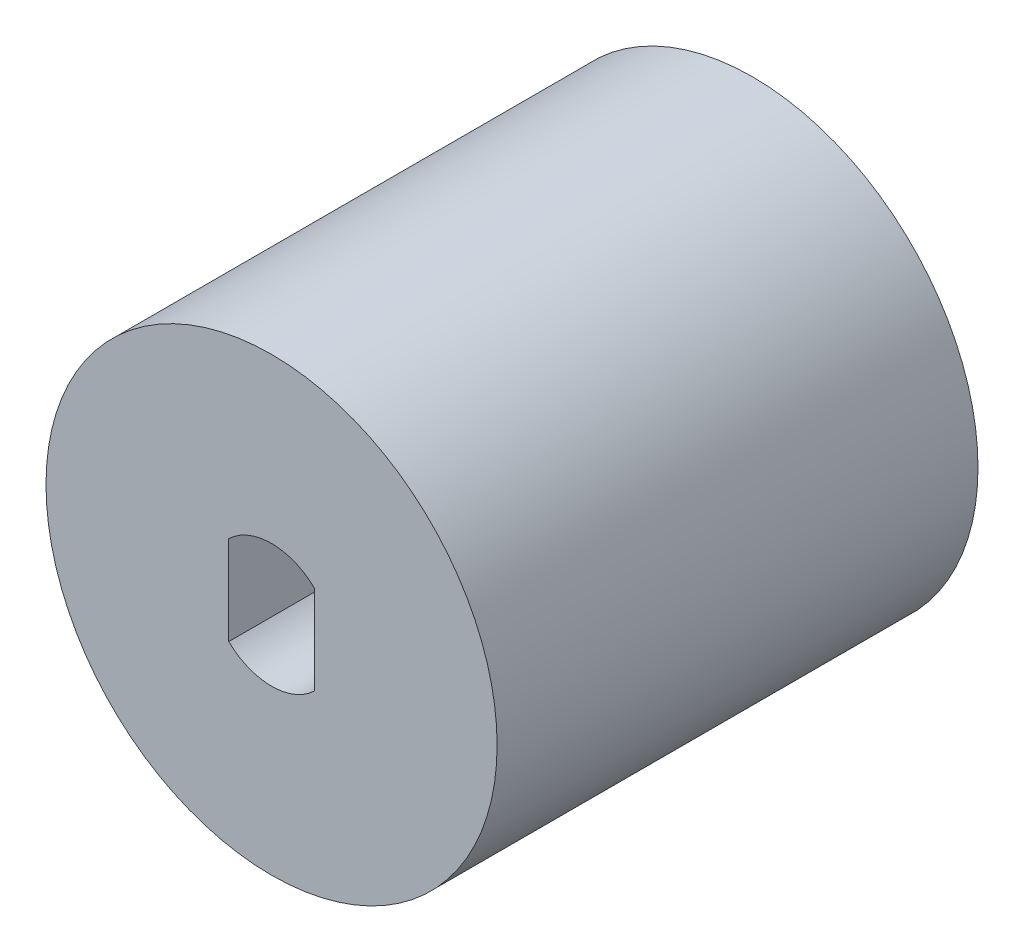
ISO-10303-21;
HEADER;
FILE_DESCRIPTION(('STEP AP214'),'2;1');
FILE_NAME('part.step','',(''),(''),'','','');
FILE_SCHEMA(('AUTOMOTIVE_DESIGN { 1 0 10303 214 1 1 1 1 }'));
ENDSEC;
DATA;
#1=APPLICATION_CONTEXT('core data for automotive mechanical design processes');
#2=APPLICATION_PROTOCOL_DEFINITION('international standard','automotive_design',2000,#1);
#3=PRODUCT_CONTEXT('',#1,'mechanical');
#4=PRODUCT('Part','Part','',(#3));
#5=PRODUCT_RELATED_PRODUCT_CATEGORY('part','',(#4));
#6=PRODUCT_DEFINITION_FORMATION('','',#4);
#7=PRODUCT_DEFINITION_CONTEXT('part definition',#1,'design');
#8=PRODUCT_DEFINITION('design','',#6,#7);
#9=PRODUCT_DEFINITION_SHAPE('','',#8);
#10=(LENGTH_UNIT() NAMED_UNIT(*) SI_UNIT(.MILLI.,.METRE.));
#11=(NAMED_UNIT(*) PLANE_ANGLE_UNIT() SI_UNIT($,.RADIAN.));
#12=(NAMED_UNIT(*) SI_UNIT($,.STERADIAN.) SOLID_ANGLE_UNIT());
#13=UNCERTAINTY_MEASURE_WITH_UNIT(LENGTH_MEASURE(1.E-05),#10,'distance_accuracy_value','');
#14=(GEOMETRIC_REPRESENTATION_CONTEXT(3) GLOBAL_UNCERTAINTY_ASSIGNED_CONTEXT((#13)) GLOBAL_UNIT_ASSIGNED_CONTEXT((#10,
#11,#12)) REPRESENTATION_CONTEXT('',''));
#15=CARTESIAN_POINT('',(0.,0.,0.));
#16=DIRECTION('',(0.,0.,1.));
#17=DIRECTION('',(1.,0.,0.));
#18=AXIS2_PLACEMENT_3D('',#15,#16,#17);
#19=CARTESIAN_POINT('',(0.,0.,21.));
#20=DIRECTION('',(0.,0.,1.));
#21=DIRECTION('',(1.,0.,0.));
#22=AXIS2_PLACEMENT_3D('',#19,#20,#21);
#23=PLANE('',#22);
#24=CARTESIAN_POINT('',(0.,0.,21.));
#25=DIRECTION('',(0.,0.,1.));
#26=DIRECTION('',(1.,0.,0.));
#27=AXIS2_PLACEMENT_3D('',#24,#25,#26);
#28=CIRCLE('',#27,9.85);
#29=CARTESIAN_POINT('',(-9.85,0.,21.));
#30=VERTEX_POINT('',#29);
#31=EDGE_CURVE('E11',#30,#30,#28,.T.);
#32=ORIENTED_EDGE('',*,*,#31,.T.);
#33=EDGE_LOOP('',(#32));
#34=FACE_BOUND('',#33,.T.);
#35=DIRECTION('',(0.,-1.,0.));
#36=VECTOR('',#35,1.);
#37=CARTESIAN_POINT('',(-1.87,1.94758825217241,21.));
#38=LINE('',#37,#36);
#39=CARTESIAN_POINT('',(-1.87,1.94758825217241,21.));
#40=VERTEX_POINT('',#39);
#41=CARTESIAN_POINT('',(-1.87,-1.94758825217241,21.));
#42=VERTEX_POINT('',#41);
#43=EDGE_CURVE('E84',#40,#42,#38,.T.);
#44=ORIENTED_EDGE('',*,*,#43,.F.);
#45=CARTESIAN_POINT('',(0.,0.,21.));
#46=DIRECTION('',(0.,0.,1.));
#47=DIRECTION('',(1.,0.,0.));
#48=AXIS2_PLACEMENT_3D('',#45,#46,#47);
#49=CIRCLE('',#48,2.7);
#50=CARTESIAN_POINT('',(1.87,1.94758825217241,21.));
#51=VERTEX_POINT('',#50);
#52=EDGE_CURVE('E89',#51,#40,#49,.T.);
#53=ORIENTED_EDGE('',*,*,#52,.F.);
#54=DIRECTION('',(0.,1.,0.));
#55=VECTOR('',#54,1.);
#56=CARTESIAN_POINT('',(1.87,1.94758825217241,21.));
#57=LINE('',#56,#55);
#58=CARTESIAN_POINT('',(1.87,-1.94758825217242,21.));
#59=VERTEX_POINT('',#58);
#60=EDGE_CURVE('E95',#59,#51,#57,.T.);
#61=ORIENTED_EDGE('',*,*,#60,.F.);
#62=CARTESIAN_POINT('',(0.,0.,21.));
#63=DIRECTION('',(0.,0.,1.));
#64=DIRECTION('',(1.,0.,0.));
#65=AXIS2_PLACEMENT_3D('',#62,#63,#64);
#66=CIRCLE('',#65,2.7);
#67=EDGE_CURVE('E54',#42,#59,#66,.T.);
#68=ORIENTED_EDGE('',*,*,#67,.F.);
#69=EDGE_LOOP('',(#44,#53,#61,#68));
#70=FACE_BOUND('',#69,.T.);
#71=ADVANCED_FACE('F39',(#34,#70),#23,.T.);
#72=CARTESIAN_POINT('',(0.,0.,0.));
#73=DIRECTION('',(0.,0.,1.));
#74=DIRECTION('',(1.,0.,0.));
#75=AXIS2_PLACEMENT_3D('',#72,#73,#74);
#76=PLANE('',#75);
#77=CARTESIAN_POINT('',(0.,0.,0.));
#78=DIRECTION('',(0.,0.,1.));
#79=DIRECTION('',(1.,0.,0.));
#80=AXIS2_PLACEMENT_3D('',#77,#78,#79);
#81=CIRCLE('',#80,9.85);
#82=CARTESIAN_POINT('',(-9.85,0.,0.));
#83=VERTEX_POINT('',#82);
#84=EDGE_CURVE('E43',#83,#83,#81,.T.);
#85=ORIENTED_EDGE('',*,*,#84,.F.);
#86=EDGE_LOOP('',(#85));
#87=FACE_BOUND('',#86,.T.);
#88=CARTESIAN_POINT('',(0.,0.,0.));
#89=DIRECTION('',(0.,0.,1.));
#90=DIRECTION('',(1.,0.,0.));
#91=AXIS2_PLACEMENT_3D('',#88,#89,#90);
#92=CIRCLE('',#91,2.7);
#93=CARTESIAN_POINT('',(1.87,1.94758825217241,0.));
#94=VERTEX_POINT('',#93);
#95=CARTESIAN_POINT('',(-1.87,1.94758825217241,0.));
#96=VERTEX_POINT('',#95);
#97=EDGE_CURVE('E62',#94,#96,#92,.T.);
#98=ORIENTED_EDGE('',*,*,#97,.T.);
#99=DIRECTION('',(0.,-1.,0.));
#100=VECTOR('',#99,1.);
#101=CARTESIAN_POINT('',(-1.87,1.94758825217241,0.));
#102=LINE('',#101,#100);
#103=CARTESIAN_POINT('',(-1.87,-1.94758825217241,0.));
#104=VERTEX_POINT('',#103);
#105=EDGE_CURVE('E86',#96,#104,#102,.T.);
#106=ORIENTED_EDGE('',*,*,#105,.T.);
#107=CARTESIAN_POINT('',(0.,0.,0.));
#108=DIRECTION('',(0.,0.,1.));
#109=DIRECTION('',(1.,0.,0.));
#110=AXIS2_PLACEMENT_3D('',#107,#108,#109);
#111=CIRCLE('',#110,2.7);
#112=CARTESIAN_POINT('',(1.87,-1.94758825217242,0.));
#113=VERTEX_POINT('',#112);
#114=EDGE_CURVE('E105',#104,#113,#111,.T.);
#115=ORIENTED_EDGE('',*,*,#114,.T.);
#116=DIRECTION('',(0.,1.,0.));
#117=VECTOR('',#116,1.);
#118=CARTESIAN_POINT('',(1.87,1.94758825217241,0.));
#119=LINE('',#118,#117);
#120=EDGE_CURVE('E101',#113,#94,#119,.T.);
#121=ORIENTED_EDGE('',*,*,#120,.T.);
#122=EDGE_LOOP('',(#98,#106,#115,#121));
#123=FACE_BOUND('',#122,.T.);
#124=ADVANCED_FACE('F116',(#87,#123),#76,.F.);
#125=CARTESIAN_POINT('',(0.,0.,21.));
#126=DIRECTION('',(0.,0.,-1.));
#127=DIRECTION('',(-1.,0.,0.));
#128=AXIS2_PLACEMENT_3D('',#125,#126,#127);
#129=CYLINDRICAL_SURFACE('',#128,9.85);
#130=CARTESIAN_POINT('',(-9.85,0.,21.));
#131=CARTESIAN_POINT('',(-9.85,0.,20.78125));
#132=CARTESIAN_POINT('',(-9.85,0.,20.5625));
#133=CARTESIAN_POINT('',(-9.85,0.,20.125));
#134=CARTESIAN_POINT('',(-9.85,0.,19.90625));
#135=CARTESIAN_POINT('',(-9.85,0.,19.46875));
#136=CARTESIAN_POINT('',(-9.85,0.,19.25));
#137=CARTESIAN_POINT('',(-9.85,0.,18.8125));
#138=CARTESIAN_POINT('',(-9.85,0.,18.59375));
#139=CARTESIAN_POINT('',(-9.85,0.,18.15625));
#140=CARTESIAN_POINT('',(-9.85,0.,17.9375));
#141=CARTESIAN_POINT('',(-9.85,0.,17.5));
#142=CARTESIAN_POINT('',(-9.85,0.,17.28125));
#143=CARTESIAN_POINT('',(-9.85,0.,16.84375));
#144=CARTESIAN_POINT('',(-9.85,0.,16.625));
#145=CARTESIAN_POINT('',(-9.85,0.,16.1875));
#146=CARTESIAN_POINT('',(-9.85,0.,15.96875));
#147=CARTESIAN_POINT('',(-9.85,0.,15.53125));
#148=CARTESIAN_POINT('',(-9.85,0.,15.3125));
#149=CARTESIAN_POINT('',(-9.85,0.,14.875));
#150=CARTESIAN_POINT('',(-9.85,0.,14.65625));
#151=CARTESIAN_POINT('',(-9.85,0.,14.21875));
#152=CARTESIAN_POINT('',(-9.85,0.,14.));
#153=CARTESIAN_POINT('',(-9.85,0.,13.5625));
#154=CARTESIAN_POINT('',(-9.85,0.,13.34375));
#155=CARTESIAN_POINT('',(-9.85,0.,12.90625));
#156=CARTESIAN_POINT('',(-9.85,0.,12.6875));
#157=CARTESIAN_POINT('',(-9.85,0.,12.25));
#158=CARTESIAN_POINT('',(-9.85,0.,12.03125));
#159=CARTESIAN_POINT('',(-9.85,0.,11.59375));
#160=CARTESIAN_POINT('',(-9.85,0.,11.375));
#161=CARTESIAN_POINT('',(-9.85,0.,10.9375));
#162=CARTESIAN_POINT('',(-9.85,0.,10.71875));
#163=CARTESIAN_POINT('',(-9.85,0.,10.28125));
#164=CARTESIAN_POINT('',(-9.85,0.,10.0625));
#165=CARTESIAN_POINT('',(-9.85,0.,9.625));
#166=CARTESIAN_POINT('',(-9.85,0.,9.40625));
#167=CARTESIAN_POINT('',(-9.85,0.,8.96875));
#168=CARTESIAN_POINT('',(-9.85,0.,8.75));
#169=CARTESIAN_POINT('',(-9.85,0.,8.3125));
#170=CARTESIAN_POINT('',(-9.85,0.,8.09375));
#171=CARTESIAN_POINT('',(-9.85,0.,7.65625));
#172=CARTESIAN_POINT('',(-9.85,0.,7.4375));
#173=CARTESIAN_POINT('',(-9.85,0.,7.));
#174=CARTESIAN_POINT('',(-9.85,0.,6.78125));
#175=CARTESIAN_POINT('',(-9.85,0.,6.34375));
#176=CARTESIAN_POINT('',(-9.85,0.,6.125));
#177=CARTESIAN_POINT('',(-9.85,0.,5.6875));
#178=CARTESIAN_POINT('',(-9.85,0.,5.46875));
#179=CARTESIAN_POINT('',(-9.85,0.,5.03125));
#180=CARTESIAN_POINT('',(-9.85,0.,4.8125));
#181=CARTESIAN_POINT('',(-9.85,0.,4.375));
#182=CARTESIAN_POINT('',(-9.85,0.,4.15625));
#183=CARTESIAN_POINT('',(-9.85,0.,3.71875));
#184=CARTESIAN_POINT('',(-9.85,0.,3.5));
#185=CARTESIAN_POINT('',(-9.85,0.,3.0625));
#186=CARTESIAN_POINT('',(-9.85,0.,2.84375));
#187=CARTESIAN_POINT('',(-9.85,0.,2.40625));
#188=CARTESIAN_POINT('',(-9.85,0.,2.1875));
#189=CARTESIAN_POINT('',(-9.85,0.,1.75));
#190=CARTESIAN_POINT('',(-9.85,0.,1.53125));
#191=CARTESIAN_POINT('',(-9.85,0.,1.09375));
#192=CARTESIAN_POINT('',(-9.85,0.,0.875000000000001));
#193=CARTESIAN_POINT('',(-9.85,0.,0.4375));
#194=CARTESIAN_POINT('',(-9.85,0.,0.21875));
#195=CARTESIAN_POINT('',(-9.85,0.,0.));
#196=B_SPLINE_CURVE_WITH_KNOTS('',3,(#130,#131,#132,#133,#134,#135,#136,#137,#138,#139,#140,
#141,#142,#143,#144,#145,#146,#147,#148,#149,#150,#151,#152,#153,#154,#155,#156,#157,#158,#159,
#160,#161,#162,#163,#164,#165,#166,#167,#168,#169,#170,#171,#172,#173,#174,#175,#176,#177,#178,
#179,#180,#181,#182,#183,#184,#185,#186,#187,#188,#189,#190,#191,#192,#193,#194,#195),
.UNSPECIFIED.,.F.,.F.,(4,2,2,2,2,2,2,2,2,2,2,2,2,2,2,2,2,2,2,2,2,2,2,2,2,2,2,2,2,2,2,2,4),(0.,
0.656249999999997,1.3125,1.96875,2.625,3.28125,3.9375,4.59375,5.25,5.90625,6.5625,7.21875,7.875,
8.53125,9.1875,9.84375,10.5,11.15625,11.8125,12.46875,13.125,13.78125,14.4375,15.09375,15.75,
16.40625,17.0625,17.71875,18.375,19.03125,19.6875,20.34375,21.),.UNSPECIFIED.);
#197=EDGE_CURVE('BSEAM41',#30,#83,#196,.T.);
#198=ORIENTED_EDGE('',*,*,#31,.F.);
#199=ORIENTED_EDGE('',*,*,#84,.T.);
#200=ORIENTED_EDGE('',*,*,#197,.T.);
#201=ORIENTED_EDGE('',*,*,#197,.F.);
#202=EDGE_LOOP('',(#198,#200,#199,#201));
#203=FACE_BOUND('',#202,.T.);
#204=ADVANCED_FACE('F41',(#203),#129,.T.);
#205=CARTESIAN_POINT('',(0.,0.,27.5686832774918));
#206=DIRECTION('',(0.,0.,-1.));
#207=DIRECTION('',(-1.,0.,0.));
#208=AXIS2_PLACEMENT_3D('',#205,#206,#207);
#209=CYLINDRICAL_SURFACE('',#208,2.7);
#210=ORIENTED_EDGE('',*,*,#52,.T.);
#211=DIRECTION('',(0.,0.,-1.));
#212=VECTOR('',#211,1.);
#213=CARTESIAN_POINT('',(-1.87,1.94758825217241,27.5686832774918));
#214=LINE('',#213,#212);
#215=EDGE_CURVE('E80',#40,#96,#214,.T.);
#216=ORIENTED_EDGE('',*,*,#215,.T.);
#217=ORIENTED_EDGE('',*,*,#97,.F.);
#218=DIRECTION('',(0.,0.,-1.));
#219=VECTOR('',#218,1.);
#220=CARTESIAN_POINT('',(1.87,1.94758825217241,27.5686832774918));
#221=LINE('',#220,#219);
#222=EDGE_CURVE('E91',#51,#94,#221,.T.);
#223=ORIENTED_EDGE('',*,*,#222,.F.);
#224=EDGE_LOOP('',(#210,#216,#217,#223));
#225=FACE_BOUND('',#224,.T.);
#226=ADVANCED_FACE('F90',(#225),#209,.F.);
#227=CARTESIAN_POINT('',(-1.87,1.94758825217241,27.5686832774918));
#228=DIRECTION('',(1.,0.,0.));
#229=DIRECTION('',(0.,0.,-1.));
#230=AXIS2_PLACEMENT_3D('',#227,#228,#229);
#231=PLANE('',#230);
#232=ORIENTED_EDGE('',*,*,#43,.T.);
#233=DIRECTION('',(0.,0.,-1.));
#234=VECTOR('',#233,1.);
#235=CARTESIAN_POINT('',(-1.87,-1.94758825217241,27.5686832774918));
#236=LINE('',#235,#234);
#237=EDGE_CURVE('E103',#42,#104,#236,.T.);
#238=ORIENTED_EDGE('',*,*,#237,.T.);
#239=ORIENTED_EDGE('',*,*,#105,.F.);
#240=ORIENTED_EDGE('',*,*,#215,.F.);
#241=EDGE_LOOP('',(#232,#238,#239,#240));
#242=FACE_BOUND('',#241,.T.);
#243=ADVANCED_FACE('F82',(#242),#231,.T.);
#244=CARTESIAN_POINT('',(0.,0.,27.5686832774918));
#245=DIRECTION('',(0.,0.,-1.));
#246=DIRECTION('',(-1.,0.,0.));
#247=AXIS2_PLACEMENT_3D('',#244,#245,#246);
#248=CYLINDRICAL_SURFACE('',#247,2.7);
#249=ORIENTED_EDGE('',*,*,#67,.T.);
#250=DIRECTION('',(0.,0.,-1.));
#251=VECTOR('',#250,1.);
#252=CARTESIAN_POINT('',(1.87,-1.94758825217242,27.5686832774918));
#253=LINE('',#252,#251);
#254=EDGE_CURVE('E106',#59,#113,#253,.T.);
#255=ORIENTED_EDGE('',*,*,#254,.T.);
#256=ORIENTED_EDGE('',*,*,#114,.F.);
#257=ORIENTED_EDGE('',*,*,#237,.F.);
#258=EDGE_LOOP('',(#249,#255,#256,#257));
#259=FACE_BOUND('',#258,.T.);
#260=ADVANCED_FACE('F119',(#259),#248,.F.);
#261=CARTESIAN_POINT('',(1.87,1.94758825217241,27.5686832774918));
#262=DIRECTION('',(-1.,0.,0.));
#263=DIRECTION('',(0.,0.,1.));
#264=AXIS2_PLACEMENT_3D('',#261,#262,#263);
#265=PLANE('',#264);
#266=ORIENTED_EDGE('',*,*,#60,.T.);
#267=ORIENTED_EDGE('',*,*,#222,.T.);
#268=ORIENTED_EDGE('',*,*,#120,.F.);
#269=ORIENTED_EDGE('',*,*,#254,.F.);
#270=EDGE_LOOP('',(#266,#267,#268,#269));
#271=FACE_BOUND('',#270,.T.);
#272=ADVANCED_FACE('F118',(#271),#265,.T.);
#273=CLOSED_SHELL('',(#71,#124,#204,#226,#243,#260,#272));
#274=MANIFOLD_SOLID_BREP('B2',#273);
#275=ADVANCED_BREP_SHAPE_REPRESENTATION('',(#18,#274),#14);
#276=SHAPE_DEFINITION_REPRESENTATION(#9,#275);
ENDSEC;
END-ISO-10303-21;
